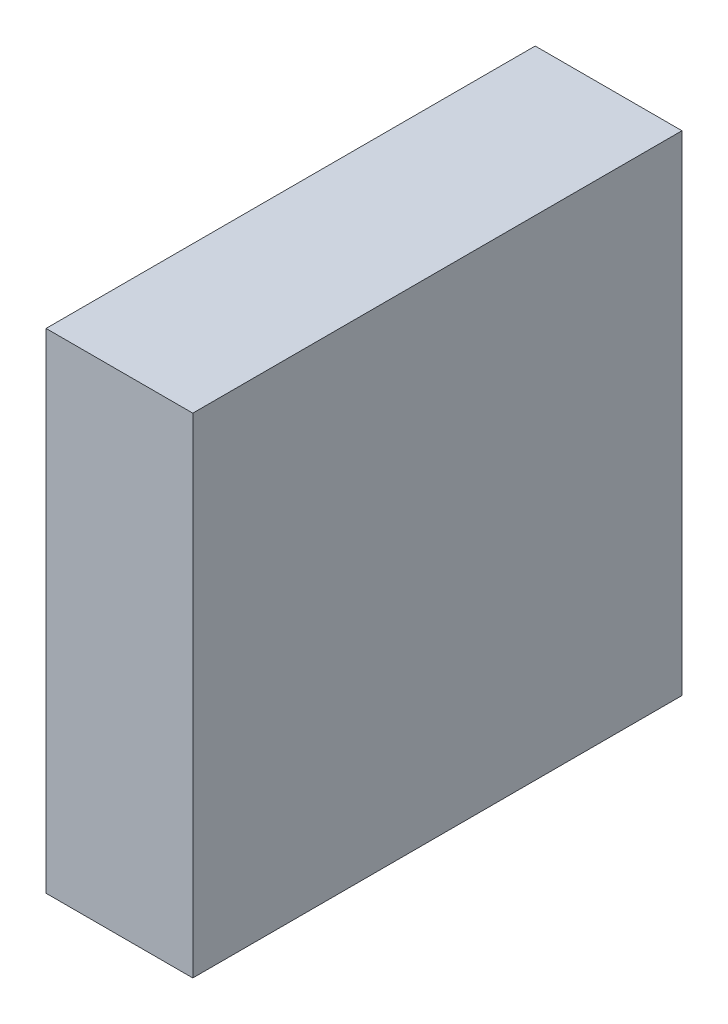
ISO-10303-21;
HEADER;
FILE_DESCRIPTION(('STEP AP214'),'2;1');
FILE_NAME('part.step','',(''),(''),'','','');
FILE_SCHEMA(('AUTOMOTIVE_DESIGN { 1 0 10303 214 1 1 1 1 }'));
ENDSEC;
DATA;
#1=APPLICATION_CONTEXT('core data for automotive mechanical design processes');
#2=APPLICATION_PROTOCOL_DEFINITION('international standard','automotive_design',2000,#1);
#3=PRODUCT_CONTEXT('',#1,'mechanical');
#4=PRODUCT('Part','Part','',(#3));
#5=PRODUCT_RELATED_PRODUCT_CATEGORY('part','',(#4));
#6=PRODUCT_DEFINITION_FORMATION('','',#4);
#7=PRODUCT_DEFINITION_CONTEXT('part definition',#1,'design');
#8=PRODUCT_DEFINITION('design','',#6,#7);
#9=PRODUCT_DEFINITION_SHAPE('','',#8);
#10=(LENGTH_UNIT() NAMED_UNIT(*) SI_UNIT(.MILLI.,.METRE.));
#11=(NAMED_UNIT(*) PLANE_ANGLE_UNIT() SI_UNIT($,.RADIAN.));
#12=(NAMED_UNIT(*) SI_UNIT($,.STERADIAN.) SOLID_ANGLE_UNIT());
#13=UNCERTAINTY_MEASURE_WITH_UNIT(LENGTH_MEASURE(1.E-05),#10,'distance_accuracy_value','');
#14=(GEOMETRIC_REPRESENTATION_CONTEXT(3) GLOBAL_UNCERTAINTY_ASSIGNED_CONTEXT((#13)) GLOBAL_UNIT_ASSIGNED_CONTEXT((#10,
#11,#12)) REPRESENTATION_CONTEXT('',''));
#15=CARTESIAN_POINT('',(0.,0.,0.));
#16=DIRECTION('',(0.,0.,1.));
#17=DIRECTION('',(1.,0.,0.));
#18=AXIS2_PLACEMENT_3D('',#15,#16,#17);
#19=CARTESIAN_POINT('',(150.,0.,0.));
#20=DIRECTION('',(0.,0.,1.));
#21=DIRECTION('',(0.,-1.,0.));
#22=AXIS2_PLACEMENT_3D('',#19,#20,#21);
#23=PLANE('',#22);
#24=DIRECTION('',(0.,1.,0.));
#25=VECTOR('',#24,1.);
#26=CARTESIAN_POINT('',(0.,0.,0.));
#27=LINE('',#26,#25);
#28=CARTESIAN_POINT('',(0.,0.,0.));
#29=VERTEX_POINT('',#28);
#30=CARTESIAN_POINT('',(0.,500.,0.));
#31=VERTEX_POINT('',#30);
#32=EDGE_CURVE('E96',#29,#31,#27,.T.);
#33=ORIENTED_EDGE('',*,*,#32,.T.);
#34=DIRECTION('',(-1.,0.,0.));
#35=VECTOR('',#34,1.);
#36=CARTESIAN_POINT('',(150.,500.,0.));
#37=LINE('',#36,#35);
#38=CARTESIAN_POINT('',(150.,500.,0.));
#39=VERTEX_POINT('',#38);
#40=EDGE_CURVE('E11',#39,#31,#37,.T.);
#41=ORIENTED_EDGE('',*,*,#40,.F.);
#42=DIRECTION('',(0.,1.,0.));
#43=VECTOR('',#42,1.);
#44=CARTESIAN_POINT('',(150.,0.,0.));
#45=LINE('',#44,#43);
#46=CARTESIAN_POINT('',(150.,0.,0.));
#47=VERTEX_POINT('',#46);
#48=EDGE_CURVE('E84',#47,#39,#45,.T.);
#49=ORIENTED_EDGE('',*,*,#48,.F.);
#50=DIRECTION('',(-1.,0.,0.));
#51=VECTOR('',#50,1.);
#52=CARTESIAN_POINT('',(150.,0.,0.));
#53=LINE('',#52,#51);
#54=EDGE_CURVE('E92',#47,#29,#53,.T.);
#55=ORIENTED_EDGE('',*,*,#54,.T.);
#56=EDGE_LOOP('',(#33,#41,#49,#55));
#57=FACE_BOUND('',#56,.T.);
#58=ADVANCED_FACE('F33',(#57),#23,.F.);
#59=CARTESIAN_POINT('',(150.,500.,0.));
#60=DIRECTION('',(0.,-1.,0.));
#61=DIRECTION('',(0.,0.,-1.));
#62=AXIS2_PLACEMENT_3D('',#59,#60,#61);
#63=PLANE('',#62);
#64=DIRECTION('',(0.,0.,1.));
#65=VECTOR('',#64,1.);
#66=CARTESIAN_POINT('',(0.,500.,0.));
#67=LINE('',#66,#65);
#68=CARTESIAN_POINT('',(0.,500.,500.));
#69=VERTEX_POINT('',#68);
#70=EDGE_CURVE('E88',#31,#69,#67,.T.);
#71=ORIENTED_EDGE('',*,*,#70,.T.);
#72=DIRECTION('',(-1.,0.,0.));
#73=VECTOR('',#72,1.);
#74=CARTESIAN_POINT('',(150.,500.,500.));
#75=LINE('',#74,#73);
#76=CARTESIAN_POINT('',(150.,500.,500.));
#77=VERTEX_POINT('',#76);
#78=EDGE_CURVE('E41',#77,#69,#75,.T.);
#79=ORIENTED_EDGE('',*,*,#78,.F.);
#80=DIRECTION('',(0.,0.,1.));
#81=VECTOR('',#80,1.);
#82=CARTESIAN_POINT('',(150.,500.,0.));
#83=LINE('',#82,#81);
#84=EDGE_CURVE('E79',#39,#77,#83,.T.);
#85=ORIENTED_EDGE('',*,*,#84,.F.);
#86=ORIENTED_EDGE('',*,*,#40,.T.);
#87=EDGE_LOOP('',(#71,#79,#85,#86));
#88=FACE_BOUND('',#87,.T.);
#89=ADVANCED_FACE('F87',(#88),#63,.F.);
#90=CARTESIAN_POINT('',(150.,0.,500.));
#91=DIRECTION('',(0.,0.,-1.));
#92=DIRECTION('',(-1.,0.,0.));
#93=AXIS2_PLACEMENT_3D('',#90,#91,#92);
#94=PLANE('',#93);
#95=DIRECTION('',(0.,-1.,0.));
#96=VECTOR('',#95,1.);
#97=CARTESIAN_POINT('',(0.,0.,500.));
#98=LINE('',#97,#96);
#99=CARTESIAN_POINT('',(0.,0.,500.));
#100=VERTEX_POINT('',#99);
#101=EDGE_CURVE('E66',#69,#100,#98,.T.);
#102=ORIENTED_EDGE('',*,*,#101,.T.);
#103=DIRECTION('',(-1.,0.,0.));
#104=VECTOR('',#103,1.);
#105=CARTESIAN_POINT('',(150.,0.,500.));
#106=LINE('',#105,#104);
#107=CARTESIAN_POINT('',(150.,0.,500.));
#108=VERTEX_POINT('',#107);
#109=EDGE_CURVE('E89',#108,#100,#106,.T.);
#110=ORIENTED_EDGE('',*,*,#109,.F.);
#111=DIRECTION('',(0.,-1.,0.));
#112=VECTOR('',#111,1.);
#113=CARTESIAN_POINT('',(150.,0.,500.));
#114=LINE('',#113,#112);
#115=EDGE_CURVE('E82',#77,#108,#114,.T.);
#116=ORIENTED_EDGE('',*,*,#115,.F.);
#117=ORIENTED_EDGE('',*,*,#78,.T.);
#118=EDGE_LOOP('',(#102,#110,#116,#117));
#119=FACE_BOUND('',#118,.T.);
#120=ADVANCED_FACE('F90',(#119),#94,.F.);
#121=CARTESIAN_POINT('',(150.,0.,0.));
#122=DIRECTION('',(0.,1.,0.));
#123=DIRECTION('',(0.,0.,1.));
#124=AXIS2_PLACEMENT_3D('',#121,#122,#123);
#125=PLANE('',#124);
#126=DIRECTION('',(0.,0.,-1.));
#127=VECTOR('',#126,1.);
#128=CARTESIAN_POINT('',(0.,0.,0.));
#129=LINE('',#128,#127);
#130=EDGE_CURVE('E72',#100,#29,#129,.T.);
#131=ORIENTED_EDGE('',*,*,#130,.T.);
#132=ORIENTED_EDGE('',*,*,#54,.F.);
#133=DIRECTION('',(0.,0.,-1.));
#134=VECTOR('',#133,1.);
#135=CARTESIAN_POINT('',(150.,0.,0.));
#136=LINE('',#135,#134);
#137=EDGE_CURVE('E49',#108,#47,#136,.T.);
#138=ORIENTED_EDGE('',*,*,#137,.F.);
#139=ORIENTED_EDGE('',*,*,#109,.T.);
#140=EDGE_LOOP('',(#131,#132,#138,#139));
#141=FACE_BOUND('',#140,.T.);
#142=ADVANCED_FACE('F103',(#141),#125,.F.);
#143=CARTESIAN_POINT('',(150.,0.,0.));
#144=DIRECTION('',(1.,0.,0.));
#145=DIRECTION('',(0.,0.,-1.));
#146=AXIS2_PLACEMENT_3D('',#143,#144,#145);
#147=PLANE('',#146);
#148=ORIENTED_EDGE('',*,*,#48,.T.);
#149=ORIENTED_EDGE('',*,*,#84,.T.);
#150=ORIENTED_EDGE('',*,*,#115,.T.);
#151=ORIENTED_EDGE('',*,*,#137,.T.);
#152=EDGE_LOOP('',(#148,#149,#150,#151));
#153=FACE_BOUND('',#152,.T.);
#154=ADVANCED_FACE('F80',(#153),#147,.T.);
#155=CARTESIAN_POINT('',(0.,0.,0.));
#156=DIRECTION('',(1.,0.,0.));
#157=DIRECTION('',(0.,0.,-1.));
#158=AXIS2_PLACEMENT_3D('',#155,#156,#157);
#159=PLANE('',#158);
#160=ORIENTED_EDGE('',*,*,#32,.F.);
#161=ORIENTED_EDGE('',*,*,#130,.F.);
#162=ORIENTED_EDGE('',*,*,#101,.F.);
#163=ORIENTED_EDGE('',*,*,#70,.F.);
#164=EDGE_LOOP('',(#160,#161,#162,#163));
#165=FACE_BOUND('',#164,.T.);
#166=ADVANCED_FACE('F106',(#165),#159,.F.);
#167=CLOSED_SHELL('',(#58,#89,#120,#142,#154,#166));
#168=MANIFOLD_SOLID_BREP('B2',#167);
#169=ADVANCED_BREP_SHAPE_REPRESENTATION('',(#18,#168),#14);
#170=SHAPE_DEFINITION_REPRESENTATION(#9,#169);
ENDSEC;
END-ISO-10303-21;
